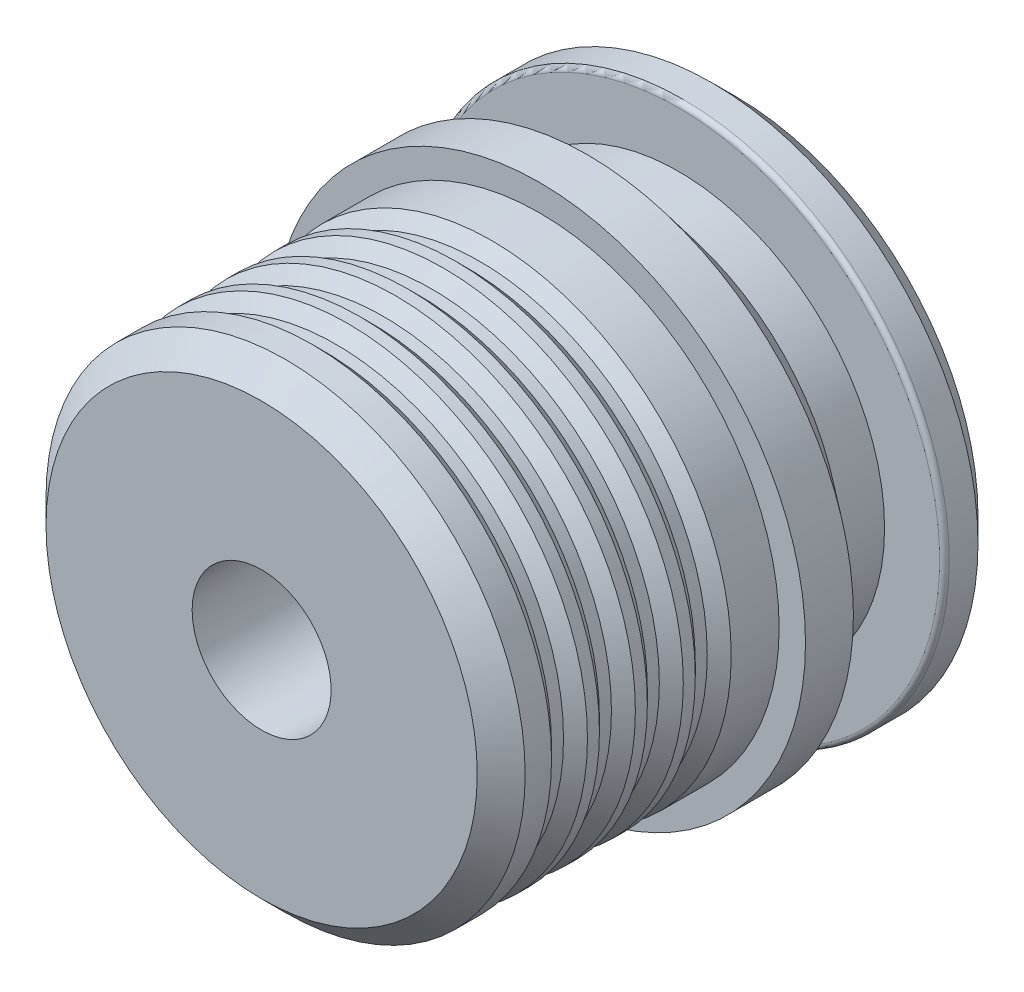
ISO-10303-21;
HEADER;
FILE_DESCRIPTION(('STEP AP214'),'2;1');
FILE_NAME('part.step','',(''),(''),'','','');
FILE_SCHEMA(('AUTOMOTIVE_DESIGN { 1 0 10303 214 1 1 1 1 }'));
ENDSEC;
DATA;
#1=APPLICATION_CONTEXT('core data for automotive mechanical design processes');
#2=APPLICATION_PROTOCOL_DEFINITION('international standard','automotive_design',2000,#1);
#3=PRODUCT_CONTEXT('',#1,'mechanical');
#4=PRODUCT('Part','Part','',(#3));
#5=PRODUCT_RELATED_PRODUCT_CATEGORY('part','',(#4));
#6=PRODUCT_DEFINITION_FORMATION('','',#4);
#7=PRODUCT_DEFINITION_CONTEXT('part definition',#1,'design');
#8=PRODUCT_DEFINITION('design','',#6,#7);
#9=PRODUCT_DEFINITION_SHAPE('','',#8);
#10=(LENGTH_UNIT() NAMED_UNIT(*) SI_UNIT(.MILLI.,.METRE.));
#11=(NAMED_UNIT(*) PLANE_ANGLE_UNIT() SI_UNIT($,.RADIAN.));
#12=(NAMED_UNIT(*) SI_UNIT($,.STERADIAN.) SOLID_ANGLE_UNIT());
#13=UNCERTAINTY_MEASURE_WITH_UNIT(LENGTH_MEASURE(1.E-05),#10,'distance_accuracy_value','');
#14=(GEOMETRIC_REPRESENTATION_CONTEXT(3) GLOBAL_UNCERTAINTY_ASSIGNED_CONTEXT((#13)) GLOBAL_UNIT_ASSIGNED_CONTEXT((#10,
#11,#12)) REPRESENTATION_CONTEXT('',''));
#15=CARTESIAN_POINT('',(0.,0.,0.));
#16=DIRECTION('',(0.,0.,1.));
#17=DIRECTION('',(1.,0.,0.));
#18=AXIS2_PLACEMENT_3D('',#15,#16,#17);
#19=CARTESIAN_POINT('',(0.,0.,10.7));
#20=DIRECTION('',(0.,0.,-1.));
#21=DIRECTION('',(-1.,0.,0.));
#22=AXIS2_PLACEMENT_3D('',#19,#20,#21);
#23=CONICAL_SURFACE('',#22,9.49999999999998,0.785398163397448);
#24=CARTESIAN_POINT('',(0.,0.,10.2));
#25=DIRECTION('',(0.,0.,-1.));
#26=DIRECTION('',(-1.,0.,0.));
#27=AXIS2_PLACEMENT_3D('',#24,#25,#26);
#28=CIRCLE('',#27,9.99999999999998);
#29=CARTESIAN_POINT('',(-9.99999999999998,0.,10.2));
#30=VERTEX_POINT('',#29);
#31=EDGE_CURVE('E62',#30,#30,#28,.T.);
#32=ORIENTED_EDGE('',*,*,#31,.F.);
#33=EDGE_LOOP('',(#32));
#34=FACE_BOUND('',#33,.T.);
#35=CARTESIAN_POINT('',(0.,0.,10.7));
#36=DIRECTION('',(0.,0.,-1.));
#37=DIRECTION('',(-1.,0.,0.));
#38=AXIS2_PLACEMENT_3D('',#35,#36,#37);
#39=CIRCLE('',#38,9.49999999999998);
#40=CARTESIAN_POINT('',(-9.49999999999998,0.,10.7));
#41=VERTEX_POINT('',#40);
#42=EDGE_CURVE('E143',#41,#41,#39,.T.);
#43=ORIENTED_EDGE('',*,*,#42,.T.);
#44=EDGE_LOOP('',(#43));
#45=FACE_BOUND('',#44,.T.);
#46=ADVANCED_FACE('F30',(#34,#45),#23,.T.);
#47=CARTESIAN_POINT('',(0.,0.,0.));
#48=DIRECTION('',(0.,0.,-1.));
#49=DIRECTION('',(-1.,0.,0.));
#50=AXIS2_PLACEMENT_3D('',#47,#48,#49);
#51=CYLINDRICAL_SURFACE('',#50,9.99999999999999);
#52=CARTESIAN_POINT('',(0.,0.,8.2));
#53=DIRECTION('',(0.,0.,-1.));
#54=DIRECTION('',(-1.,0.,0.));
#55=AXIS2_PLACEMENT_3D('',#52,#53,#54);
#56=CIRCLE('',#55,10.);
#57=CARTESIAN_POINT('',(-10.,0.,8.2));
#58=VERTEX_POINT('',#57);
#59=EDGE_CURVE('E65',#58,#58,#56,.T.);
#60=ORIENTED_EDGE('',*,*,#59,.F.);
#61=EDGE_LOOP('',(#60));
#62=FACE_BOUND('',#61,.T.);
#63=ORIENTED_EDGE('',*,*,#31,.T.);
#64=EDGE_LOOP('',(#63));
#65=FACE_BOUND('',#64,.T.);
#66=ADVANCED_FACE('F245',(#62,#65),#51,.T.);
#67=CARTESIAN_POINT('',(11.1,0.,8.2));
#68=DIRECTION('',(0.,0.,-1.));
#69=DIRECTION('',(-1.,0.,0.));
#70=AXIS2_PLACEMENT_3D('',#67,#68,#69);
#71=PLANE('',#70);
#72=CARTESIAN_POINT('',(0.,0.,8.2));
#73=DIRECTION('',(0.,0.,-1.));
#74=DIRECTION('',(-1.,0.,0.));
#75=AXIS2_PLACEMENT_3D('',#72,#73,#74);
#76=CIRCLE('',#75,11.1);
#77=CARTESIAN_POINT('',(-11.1,0.,8.2));
#78=VERTEX_POINT('',#77);
#79=EDGE_CURVE('E68',#78,#78,#76,.T.);
#80=ORIENTED_EDGE('',*,*,#79,.F.);
#81=EDGE_LOOP('',(#80));
#82=FACE_BOUND('',#81,.T.);
#83=ORIENTED_EDGE('',*,*,#59,.T.);
#84=EDGE_LOOP('',(#83));
#85=FACE_BOUND('',#84,.T.);
#86=ADVANCED_FACE('F251',(#82,#85),#71,.F.);
#87=CARTESIAN_POINT('',(0.,0.,0.));
#88=DIRECTION('',(0.,0.,-1.));
#89=DIRECTION('',(-1.,0.,0.));
#90=AXIS2_PLACEMENT_3D('',#87,#88,#89);
#91=CYLINDRICAL_SURFACE('',#90,11.1);
#92=CARTESIAN_POINT('',(0.,0.,6.2));
#93=DIRECTION('',(0.,0.,-1.));
#94=DIRECTION('',(-1.,0.,0.));
#95=AXIS2_PLACEMENT_3D('',#92,#93,#94);
#96=CIRCLE('',#95,11.1);
#97=CARTESIAN_POINT('',(-11.1,0.,6.2));
#98=VERTEX_POINT('',#97);
#99=EDGE_CURVE('E71',#98,#98,#96,.T.);
#100=ORIENTED_EDGE('',*,*,#99,.F.);
#101=EDGE_LOOP('',(#100));
#102=FACE_BOUND('',#101,.T.);
#103=ORIENTED_EDGE('',*,*,#79,.T.);
#104=EDGE_LOOP('',(#103));
#105=FACE_BOUND('',#104,.T.);
#106=ADVANCED_FACE('F315',(#102,#105),#91,.T.);
#107=CARTESIAN_POINT('',(0.,0.,6.2));
#108=DIRECTION('',(0.,0.,1.));
#109=DIRECTION('',(1.,0.,0.));
#110=AXIS2_PLACEMENT_3D('',#107,#108,#109);
#111=CONICAL_SURFACE('',#110,11.1,0.896055384571345);
#112=CARTESIAN_POINT('',(0.,0.,4.2));
#113=DIRECTION('',(0.,0.,-1.));
#114=DIRECTION('',(-1.,0.,0.));
#115=AXIS2_PLACEMENT_3D('',#112,#113,#114);
#116=CIRCLE('',#115,8.6);
#117=CARTESIAN_POINT('',(-8.6,0.,4.2));
#118=VERTEX_POINT('',#117);
#119=EDGE_CURVE('E74',#118,#118,#116,.T.);
#120=ORIENTED_EDGE('',*,*,#119,.F.);
#121=EDGE_LOOP('',(#120));
#122=FACE_BOUND('',#121,.T.);
#123=ORIENTED_EDGE('',*,*,#99,.T.);
#124=EDGE_LOOP('',(#123));
#125=FACE_BOUND('',#124,.T.);
#126=ADVANCED_FACE('F311',(#122,#125),#111,.T.);
#127=CARTESIAN_POINT('',(0.,0.,0.));
#128=DIRECTION('',(0.,0.,-1.));
#129=DIRECTION('',(-1.,0.,0.));
#130=AXIS2_PLACEMENT_3D('',#127,#128,#129);
#131=CYLINDRICAL_SURFACE('',#130,8.6);
#132=CARTESIAN_POINT('',(0.,0.,2.4));
#133=DIRECTION('',(0.,0.,-1.));
#134=DIRECTION('',(-1.,0.,0.));
#135=AXIS2_PLACEMENT_3D('',#132,#133,#134);
#136=CIRCLE('',#135,8.6);
#137=CARTESIAN_POINT('',(-8.6,0.,2.4));
#138=VERTEX_POINT('',#137);
#139=EDGE_CURVE('E77',#138,#138,#136,.T.);
#140=ORIENTED_EDGE('',*,*,#139,.F.);
#141=EDGE_LOOP('',(#140));
#142=FACE_BOUND('',#141,.T.);
#143=ORIENTED_EDGE('',*,*,#119,.T.);
#144=EDGE_LOOP('',(#143));
#145=FACE_BOUND('',#144,.T.);
#146=ADVANCED_FACE('F308',(#142,#145),#131,.T.);
#147=CARTESIAN_POINT('',(11.1,0.,2.4));
#148=DIRECTION('',(0.,0.,-1.));
#149=DIRECTION('',(-1.,0.,0.));
#150=AXIS2_PLACEMENT_3D('',#147,#148,#149);
#151=PLANE('',#150);
#152=CARTESIAN_POINT('',(0.,0.,2.4));
#153=DIRECTION('',(0.,0.,-1.));
#154=DIRECTION('',(-1.,0.,0.));
#155=AXIS2_PLACEMENT_3D('',#152,#153,#154);
#156=CIRCLE('',#155,10.9);
#157=CARTESIAN_POINT('',(-10.9,0.,2.4));
#158=VERTEX_POINT('',#157);
#159=EDGE_CURVE('E10',#158,#158,#156,.F.);
#160=ORIENTED_EDGE('',*,*,#159,.T.);
#161=EDGE_LOOP('',(#160));
#162=FACE_BOUND('',#161,.T.);
#163=ORIENTED_EDGE('',*,*,#139,.T.);
#164=EDGE_LOOP('',(#163));
#165=FACE_BOUND('',#164,.T.);
#166=ADVANCED_FACE('F305',(#162,#165),#151,.F.);
#167=CARTESIAN_POINT('',(0.,0.,0.));
#168=DIRECTION('',(0.,0.,-1.));
#169=DIRECTION('',(-1.,0.,0.));
#170=AXIS2_PLACEMENT_3D('',#167,#168,#169);
#171=CYLINDRICAL_SURFACE('',#170,11.1);
#172=CARTESIAN_POINT('',(0.,0.,2.2));
#173=DIRECTION('',(0.,0.,-1.));
#174=DIRECTION('',(-1.,0.,0.));
#175=AXIS2_PLACEMENT_3D('',#172,#173,#174);
#176=CIRCLE('',#175,11.1);
#177=CARTESIAN_POINT('',(-11.1,0.,2.2));
#178=VERTEX_POINT('',#177);
#179=EDGE_CURVE('E37',#178,#178,#176,.T.);
#180=ORIENTED_EDGE('',*,*,#179,.T.);
#181=EDGE_LOOP('',(#180));
#182=FACE_BOUND('',#181,.T.);
#183=CARTESIAN_POINT('',(0.,0.,1.));
#184=DIRECTION('',(0.,0.,1.));
#185=DIRECTION('',(1.,0.,0.));
#186=AXIS2_PLACEMENT_3D('',#183,#184,#185);
#187=CIRCLE('',#186,11.1);
#188=CARTESIAN_POINT('',(11.1,0.,1.));
#189=VERTEX_POINT('',#188);
#190=EDGE_CURVE('E41',#189,#189,#187,.T.);
#191=ORIENTED_EDGE('',*,*,#190,.T.);
#192=EDGE_LOOP('',(#191));
#193=FACE_BOUND('',#192,.T.);
#194=ADVANCED_FACE('F278',(#182,#193),#171,.T.);
#195=CARTESIAN_POINT('',(11.1,0.,0.));
#196=DIRECTION('',(0.,0.,1.));
#197=DIRECTION('',(1.,0.,0.));
#198=AXIS2_PLACEMENT_3D('',#195,#196,#197);
#199=PLANE('',#198);
#200=CARTESIAN_POINT('',(0.,0.,0.));
#201=DIRECTION('',(0.,0.,1.));
#202=DIRECTION('',(1.,0.,0.));
#203=AXIS2_PLACEMENT_3D('',#200,#201,#202);
#204=CIRCLE('',#203,10.1);
#205=CARTESIAN_POINT('',(10.1,0.,0.));
#206=VERTEX_POINT('',#205);
#207=EDGE_CURVE('E45',#206,#206,#204,.F.);
#208=ORIENTED_EDGE('',*,*,#207,.T.);
#209=EDGE_LOOP('',(#208));
#210=FACE_BOUND('',#209,.T.);
#211=CARTESIAN_POINT('',(0.,0.,0.));
#212=DIRECTION('',(0.,0.,1.));
#213=DIRECTION('',(1.,0.,0.));
#214=AXIS2_PLACEMENT_3D('',#211,#212,#213);
#215=CIRCLE('',#214,7.25000000000001);
#216=CARTESIAN_POINT('',(7.25000000000001,0.,0.));
#217=VERTEX_POINT('',#216);
#218=EDGE_CURVE('E50',#217,#217,#215,.T.);
#219=ORIENTED_EDGE('',*,*,#218,.T.);
#220=EDGE_LOOP('',(#219));
#221=FACE_BOUND('',#220,.T.);
#222=ADVANCED_FACE('F274',(#210,#221),#199,.F.);
#223=CARTESIAN_POINT('',(0.,0.,0.));
#224=DIRECTION('',(0.,0.,-1.));
#225=DIRECTION('',(-1.,0.,0.));
#226=AXIS2_PLACEMENT_3D('',#223,#224,#225);
#227=CYLINDRICAL_SURFACE('',#226,6.25);
#228=CARTESIAN_POINT('',(0.,0.,0.999999999999999));
#229=DIRECTION('',(0.,0.,1.));
#230=DIRECTION('',(1.,0.,0.));
#231=AXIS2_PLACEMENT_3D('',#228,#229,#230);
#232=CIRCLE('',#231,6.25);
#233=CARTESIAN_POINT('',(6.25,0.,0.999999999999999));
#234=VERTEX_POINT('',#233);
#235=EDGE_CURVE('E53',#234,#234,#232,.F.);
#236=ORIENTED_EDGE('',*,*,#235,.T.);
#237=EDGE_LOOP('',(#236));
#238=FACE_BOUND('',#237,.T.);
#239=CARTESIAN_POINT('',(0.,0.,7.73634480157131));
#240=DIRECTION('',(0.,0.,-1.));
#241=DIRECTION('',(-1.,0.,0.));
#242=AXIS2_PLACEMENT_3D('',#239,#240,#241);
#243=CIRCLE('',#242,6.25);
#244=CARTESIAN_POINT('',(-6.25,0.,7.73634480157131));
#245=VERTEX_POINT('',#244);
#246=EDGE_CURVE('E80',#245,#245,#243,.T.);
#247=ORIENTED_EDGE('',*,*,#246,.F.);
#248=EDGE_LOOP('',(#247));
#249=FACE_BOUND('',#248,.T.);
#250=ADVANCED_FACE('F277',(#238,#249),#227,.F.);
#251=CARTESIAN_POINT('',(0.,0.,7.73634480157131));
#252=DIRECTION('',(0.,0.,-1.));
#253=DIRECTION('',(-1.,0.,0.));
#254=AXIS2_PLACEMENT_3D('',#251,#252,#253);
#255=CONICAL_SURFACE('',#254,6.25,1.30899693899575);
#256=CARTESIAN_POINT('',(0.,0.,8.5));
#257=DIRECTION('',(0.,0.,-1.));
#258=DIRECTION('',(-1.,0.,0.));
#259=AXIS2_PLACEMENT_3D('',#256,#257,#258);
#260=CIRCLE('',#259,3.4);
#261=CARTESIAN_POINT('',(-3.4,0.,8.5));
#262=VERTEX_POINT('',#261);
#263=EDGE_CURVE('E83',#262,#262,#260,.T.);
#264=ORIENTED_EDGE('',*,*,#263,.F.);
#265=EDGE_LOOP('',(#264));
#266=FACE_BOUND('',#265,.T.);
#267=ORIENTED_EDGE('',*,*,#246,.T.);
#268=EDGE_LOOP('',(#267));
#269=FACE_BOUND('',#268,.T.);
#270=ADVANCED_FACE('F286',(#266,#269),#255,.F.);
#271=CARTESIAN_POINT('',(0.,0.,0.));
#272=DIRECTION('',(0.,0.,-1.));
#273=DIRECTION('',(-1.,0.,0.));
#274=AXIS2_PLACEMENT_3D('',#271,#272,#273);
#275=CYLINDRICAL_SURFACE('',#274,3.4);
#276=CARTESIAN_POINT('',(0.,0.,10.));
#277=DIRECTION('',(0.,0.,-1.));
#278=DIRECTION('',(-1.,0.,0.));
#279=AXIS2_PLACEMENT_3D('',#276,#277,#278);
#280=CIRCLE('',#279,3.4);
#281=CARTESIAN_POINT('',(-3.4,0.,10.));
#282=VERTEX_POINT('',#281);
#283=EDGE_CURVE('E86',#282,#282,#280,.T.);
#284=ORIENTED_EDGE('',*,*,#283,.F.);
#285=EDGE_LOOP('',(#284));
#286=FACE_BOUND('',#285,.T.);
#287=ORIENTED_EDGE('',*,*,#263,.T.);
#288=EDGE_LOOP('',(#287));
#289=FACE_BOUND('',#288,.T.);
#290=ADVANCED_FACE('F291',(#286,#289),#275,.F.);
#291=CARTESIAN_POINT('',(4.4,0.,10.));
#292=DIRECTION('',(0.,0.,-1.));
#293=DIRECTION('',(-1.,0.,0.));
#294=AXIS2_PLACEMENT_3D('',#291,#292,#293);
#295=PLANE('',#294);
#296=CARTESIAN_POINT('',(0.,0.,10.));
#297=DIRECTION('',(0.,0.,-1.));
#298=DIRECTION('',(-1.,0.,0.));
#299=AXIS2_PLACEMENT_3D('',#296,#297,#298);
#300=CIRCLE('',#299,4.4);
#301=CARTESIAN_POINT('',(-4.4,0.,10.));
#302=VERTEX_POINT('',#301);
#303=EDGE_CURVE('E89',#302,#302,#300,.T.);
#304=ORIENTED_EDGE('',*,*,#303,.F.);
#305=EDGE_LOOP('',(#304));
#306=FACE_BOUND('',#305,.T.);
#307=ORIENTED_EDGE('',*,*,#283,.T.);
#308=EDGE_LOOP('',(#307));
#309=FACE_BOUND('',#308,.T.);
#310=ADVANCED_FACE('F297',(#306,#309),#295,.F.);
#311=CARTESIAN_POINT('',(0.,0.,0.));
#312=DIRECTION('',(0.,0.,-1.));
#313=DIRECTION('',(-1.,0.,0.));
#314=AXIS2_PLACEMENT_3D('',#311,#312,#313);
#315=CYLINDRICAL_SURFACE('',#314,4.4);
#316=CARTESIAN_POINT('',(0.,0.,11.8));
#317=DIRECTION('',(0.,0.,-1.));
#318=DIRECTION('',(-1.,0.,0.));
#319=AXIS2_PLACEMENT_3D('',#316,#317,#318);
#320=CIRCLE('',#319,4.4);
#321=CARTESIAN_POINT('',(-4.4,0.,11.8));
#322=VERTEX_POINT('',#321);
#323=EDGE_CURVE('E92',#322,#322,#320,.T.);
#324=ORIENTED_EDGE('',*,*,#323,.F.);
#325=EDGE_LOOP('',(#324));
#326=FACE_BOUND('',#325,.T.);
#327=ORIENTED_EDGE('',*,*,#303,.T.);
#328=EDGE_LOOP('',(#327));
#329=FACE_BOUND('',#328,.T.);
#330=ADVANCED_FACE('F468',(#326,#329),#315,.F.);
#331=CARTESIAN_POINT('',(2.9,0.,11.8));
#332=DIRECTION('',(0.,0.,1.));
#333=DIRECTION('',(1.,0.,0.));
#334=AXIS2_PLACEMENT_3D('',#331,#332,#333);
#335=PLANE('',#334);
#336=CARTESIAN_POINT('',(0.,0.,11.8));
#337=DIRECTION('',(0.,0.,-1.));
#338=DIRECTION('',(-1.,0.,0.));
#339=AXIS2_PLACEMENT_3D('',#336,#337,#338);
#340=CIRCLE('',#339,2.9);
#341=CARTESIAN_POINT('',(-2.9,0.,11.8));
#342=VERTEX_POINT('',#341);
#343=EDGE_CURVE('E95',#342,#342,#340,.T.);
#344=ORIENTED_EDGE('',*,*,#343,.F.);
#345=EDGE_LOOP('',(#344));
#346=FACE_BOUND('',#345,.T.);
#347=ORIENTED_EDGE('',*,*,#323,.T.);
#348=EDGE_LOOP('',(#347));
#349=FACE_BOUND('',#348,.T.);
#350=ADVANCED_FACE('F458',(#346,#349),#335,.F.);
#351=CARTESIAN_POINT('',(0.,0.,0.));
#352=DIRECTION('',(0.,0.,-1.));
#353=DIRECTION('',(-1.,0.,0.));
#354=AXIS2_PLACEMENT_3D('',#351,#352,#353);
#355=CYLINDRICAL_SURFACE('',#354,2.9);
#356=CARTESIAN_POINT('',(0.,0.,19.8));
#357=DIRECTION('',(0.,0.,-1.));
#358=DIRECTION('',(-1.,0.,0.));
#359=AXIS2_PLACEMENT_3D('',#356,#357,#358);
#360=CIRCLE('',#359,2.9);
#361=CARTESIAN_POINT('',(-2.9,0.,19.8));
#362=VERTEX_POINT('',#361);
#363=EDGE_CURVE('E98',#362,#362,#360,.T.);
#364=ORIENTED_EDGE('',*,*,#363,.F.);
#365=EDGE_LOOP('',(#364));
#366=FACE_BOUND('',#365,.T.);
#367=ORIENTED_EDGE('',*,*,#343,.T.);
#368=EDGE_LOOP('',(#367));
#369=FACE_BOUND('',#368,.T.);
#370=ADVANCED_FACE('F241',(#366,#369),#355,.F.);
#371=CARTESIAN_POINT('',(10.,0.,19.8));
#372=DIRECTION('',(0.,0.,-1.));
#373=DIRECTION('',(-1.,0.,0.));
#374=AXIS2_PLACEMENT_3D('',#371,#372,#373);
#375=PLANE('',#374);
#376=CARTESIAN_POINT('',(0.,0.,19.8));
#377=DIRECTION('',(0.,0.,-1.));
#378=DIRECTION('',(-1.,0.,0.));
#379=AXIS2_PLACEMENT_3D('',#376,#377,#378);
#380=CIRCLE('',#379,8.99999999999999);
#381=CARTESIAN_POINT('',(-8.99999999999999,0.,19.8));
#382=VERTEX_POINT('',#381);
#383=EDGE_CURVE('E56',#382,#382,#380,.F.);
#384=ORIENTED_EDGE('',*,*,#383,.T.);
#385=EDGE_LOOP('',(#384));
#386=FACE_BOUND('',#385,.T.);
#387=ORIENTED_EDGE('',*,*,#363,.T.);
#388=EDGE_LOOP('',(#387));
#389=FACE_BOUND('',#388,.T.);
#390=ADVANCED_FACE('F235',(#386,#389),#375,.F.);
#391=CARTESIAN_POINT('',(0.,0.,0.));
#392=DIRECTION('',(0.,0.,-1.));
#393=DIRECTION('',(-1.,0.,0.));
#394=AXIS2_PLACEMENT_3D('',#391,#392,#393);
#395=CYLINDRICAL_SURFACE('',#394,10.);
#396=CARTESIAN_POINT('',(0.,0.,18.8));
#397=DIRECTION('',(0.,0.,-1.));
#398=DIRECTION('',(-1.,0.,0.));
#399=AXIS2_PLACEMENT_3D('',#396,#397,#398);
#400=CIRCLE('',#399,10.);
#401=CARTESIAN_POINT('',(-10.,0.,18.8));
#402=VERTEX_POINT('',#401);
#403=EDGE_CURVE('E59',#402,#402,#400,.T.);
#404=ORIENTED_EDGE('',*,*,#403,.T.);
#405=EDGE_LOOP('',(#404));
#406=FACE_BOUND('',#405,.T.);
#407=CARTESIAN_POINT('',(0.,0.,17.6999999999999));
#408=DIRECTION('',(0.,0.,-1.));
#409=DIRECTION('',(-1.,0.,0.));
#410=AXIS2_PLACEMENT_3D('',#407,#408,#409);
#411=CIRCLE('',#410,10.);
#412=CARTESIAN_POINT('',(-10.,0.,17.6999999999999));
#413=VERTEX_POINT('',#412);
#414=EDGE_CURVE('E101',#413,#413,#411,.T.);
#415=ORIENTED_EDGE('',*,*,#414,.F.);
#416=EDGE_LOOP('',(#415));
#417=FACE_BOUND('',#416,.T.);
#418=ADVANCED_FACE('F230',(#406,#417),#395,.T.);
#419=CARTESIAN_POINT('',(0.,0.,17.6999999999999));
#420=DIRECTION('',(0.,0.,1.));
#421=DIRECTION('',(1.,0.,0.));
#422=AXIS2_PLACEMENT_3D('',#419,#420,#421);
#423=CONICAL_SURFACE('',#422,10.,0.785398163397466);
#424=CARTESIAN_POINT('',(0.,0.,17.1999999999999));
#425=DIRECTION('',(0.,0.,-1.));
#426=DIRECTION('',(-1.,0.,0.));
#427=AXIS2_PLACEMENT_3D('',#424,#425,#426);
#428=CIRCLE('',#427,9.49999999999998);
#429=CARTESIAN_POINT('',(-9.49999999999998,0.,17.1999999999999));
#430=VERTEX_POINT('',#429);
#431=EDGE_CURVE('E104',#430,#430,#428,.T.);
#432=ORIENTED_EDGE('',*,*,#431,.F.);
#433=EDGE_LOOP('',(#432));
#434=FACE_BOUND('',#433,.T.);
#435=ORIENTED_EDGE('',*,*,#414,.T.);
#436=EDGE_LOOP('',(#435));
#437=FACE_BOUND('',#436,.T.);
#438=ADVANCED_FACE('F224',(#434,#437),#423,.T.);
#439=CARTESIAN_POINT('',(0.,0.,0.));
#440=DIRECTION('',(0.,0.,-1.));
#441=DIRECTION('',(-1.,0.,0.));
#442=AXIS2_PLACEMENT_3D('',#439,#440,#441);
#443=CYLINDRICAL_SURFACE('',#442,9.49999999999998);
#444=CARTESIAN_POINT('',(0.,0.,16.6999999999999));
#445=DIRECTION('',(0.,0.,-1.));
#446=DIRECTION('',(-1.,0.,0.));
#447=AXIS2_PLACEMENT_3D('',#444,#445,#446);
#448=CIRCLE('',#447,9.49999999999998);
#449=CARTESIAN_POINT('',(-9.49999999999998,0.,16.6999999999999));
#450=VERTEX_POINT('',#449);
#451=EDGE_CURVE('E107',#450,#450,#448,.T.);
#452=ORIENTED_EDGE('',*,*,#451,.F.);
#453=EDGE_LOOP('',(#452));
#454=FACE_BOUND('',#453,.T.);
#455=ORIENTED_EDGE('',*,*,#431,.T.);
#456=EDGE_LOOP('',(#455));
#457=FACE_BOUND('',#456,.T.);
#458=ADVANCED_FACE('F218',(#454,#457),#443,.T.);
#459=CARTESIAN_POINT('',(0.,0.,16.6999999999999));
#460=DIRECTION('',(0.,0.,-1.));
#461=DIRECTION('',(-1.,0.,0.));
#462=AXIS2_PLACEMENT_3D('',#459,#460,#461);
#463=CONICAL_SURFACE('',#462,9.49999999999998,0.78539816339745);
#464=CARTESIAN_POINT('',(0.,0.,16.1999999999999));
#465=DIRECTION('',(0.,0.,-1.));
#466=DIRECTION('',(-1.,0.,0.));
#467=AXIS2_PLACEMENT_3D('',#464,#465,#466);
#468=CIRCLE('',#467,9.99999999999998);
#469=CARTESIAN_POINT('',(-9.99999999999998,0.,16.1999999999999));
#470=VERTEX_POINT('',#469);
#471=EDGE_CURVE('E110',#470,#470,#468,.T.);
#472=ORIENTED_EDGE('',*,*,#471,.F.);
#473=EDGE_LOOP('',(#472));
#474=FACE_BOUND('',#473,.T.);
#475=ORIENTED_EDGE('',*,*,#451,.T.);
#476=EDGE_LOOP('',(#475));
#477=FACE_BOUND('',#476,.T.);
#478=ADVANCED_FACE('F212',(#474,#477),#463,.T.);
#479=CARTESIAN_POINT('',(0.,0.,0.));
#480=DIRECTION('',(0.,0.,-1.));
#481=DIRECTION('',(-1.,0.,0.));
#482=AXIS2_PLACEMENT_3D('',#479,#480,#481);
#483=CYLINDRICAL_SURFACE('',#482,9.99999999999999);
#484=CARTESIAN_POINT('',(0.,0.,15.6999999999999));
#485=DIRECTION('',(0.,0.,-1.));
#486=DIRECTION('',(-1.,0.,0.));
#487=AXIS2_PLACEMENT_3D('',#484,#485,#486);
#488=CIRCLE('',#487,10.);
#489=CARTESIAN_POINT('',(-10.,0.,15.6999999999999));
#490=VERTEX_POINT('',#489);
#491=EDGE_CURVE('E113',#490,#490,#488,.T.);
#492=ORIENTED_EDGE('',*,*,#491,.F.);
#493=EDGE_LOOP('',(#492));
#494=FACE_BOUND('',#493,.T.);
#495=ORIENTED_EDGE('',*,*,#471,.T.);
#496=EDGE_LOOP('',(#495));
#497=FACE_BOUND('',#496,.T.);
#498=ADVANCED_FACE('F206',(#494,#497),#483,.T.);
#499=CARTESIAN_POINT('',(0.,0.,15.6999999999999));
#500=DIRECTION('',(0.,0.,1.));
#501=DIRECTION('',(1.,0.,0.));
#502=AXIS2_PLACEMENT_3D('',#499,#500,#501);
#503=CONICAL_SURFACE('',#502,10.,0.785398163397467);
#504=CARTESIAN_POINT('',(0.,0.,15.2));
#505=DIRECTION('',(0.,0.,-1.));
#506=DIRECTION('',(-1.,0.,0.));
#507=AXIS2_PLACEMENT_3D('',#504,#505,#506);
#508=CIRCLE('',#507,9.49999999999998);
#509=CARTESIAN_POINT('',(-9.49999999999998,0.,15.2));
#510=VERTEX_POINT('',#509);
#511=EDGE_CURVE('E116',#510,#510,#508,.T.);
#512=ORIENTED_EDGE('',*,*,#511,.F.);
#513=EDGE_LOOP('',(#512));
#514=FACE_BOUND('',#513,.T.);
#515=ORIENTED_EDGE('',*,*,#491,.T.);
#516=EDGE_LOOP('',(#515));
#517=FACE_BOUND('',#516,.T.);
#518=ADVANCED_FACE('F200',(#514,#517),#503,.T.);
#519=CARTESIAN_POINT('',(0.,0.,0.));
#520=DIRECTION('',(0.,0.,-1.));
#521=DIRECTION('',(-1.,0.,0.));
#522=AXIS2_PLACEMENT_3D('',#519,#520,#521);
#523=CYLINDRICAL_SURFACE('',#522,9.49999999999998);
#524=CARTESIAN_POINT('',(0.,0.,14.7));
#525=DIRECTION('',(0.,0.,-1.));
#526=DIRECTION('',(-1.,0.,0.));
#527=AXIS2_PLACEMENT_3D('',#524,#525,#526);
#528=CIRCLE('',#527,9.49999999999998);
#529=CARTESIAN_POINT('',(-9.49999999999998,0.,14.7));
#530=VERTEX_POINT('',#529);
#531=EDGE_CURVE('E119',#530,#530,#528,.T.);
#532=ORIENTED_EDGE('',*,*,#531,.F.);
#533=EDGE_LOOP('',(#532));
#534=FACE_BOUND('',#533,.T.);
#535=ORIENTED_EDGE('',*,*,#511,.T.);
#536=EDGE_LOOP('',(#535));
#537=FACE_BOUND('',#536,.T.);
#538=ADVANCED_FACE('F194',(#534,#537),#523,.T.);
#539=CARTESIAN_POINT('',(0.,0.,14.7));
#540=DIRECTION('',(0.,0.,-1.));
#541=DIRECTION('',(-1.,0.,0.));
#542=AXIS2_PLACEMENT_3D('',#539,#540,#541);
#543=CONICAL_SURFACE('',#542,9.49999999999998,0.785398163397448);
#544=CARTESIAN_POINT('',(0.,0.,14.2));
#545=DIRECTION('',(0.,0.,-1.));
#546=DIRECTION('',(-1.,0.,0.));
#547=AXIS2_PLACEMENT_3D('',#544,#545,#546);
#548=CIRCLE('',#547,9.99999999999998);
#549=CARTESIAN_POINT('',(-9.99999999999998,0.,14.2));
#550=VERTEX_POINT('',#549);
#551=EDGE_CURVE('E122',#550,#550,#548,.T.);
#552=ORIENTED_EDGE('',*,*,#551,.F.);
#553=EDGE_LOOP('',(#552));
#554=FACE_BOUND('',#553,.T.);
#555=ORIENTED_EDGE('',*,*,#531,.T.);
#556=EDGE_LOOP('',(#555));
#557=FACE_BOUND('',#556,.T.);
#558=ADVANCED_FACE('F188',(#554,#557),#543,.T.);
#559=CARTESIAN_POINT('',(0.,0.,0.));
#560=DIRECTION('',(0.,0.,-1.));
#561=DIRECTION('',(-1.,0.,0.));
#562=AXIS2_PLACEMENT_3D('',#559,#560,#561);
#563=CYLINDRICAL_SURFACE('',#562,9.99999999999999);
#564=CARTESIAN_POINT('',(0.,0.,13.7));
#565=DIRECTION('',(0.,0.,-1.));
#566=DIRECTION('',(-1.,0.,0.));
#567=AXIS2_PLACEMENT_3D('',#564,#565,#566);
#568=CIRCLE('',#567,10.);
#569=CARTESIAN_POINT('',(-10.,0.,13.7));
#570=VERTEX_POINT('',#569);
#571=EDGE_CURVE('E125',#570,#570,#568,.T.);
#572=ORIENTED_EDGE('',*,*,#571,.F.);
#573=EDGE_LOOP('',(#572));
#574=FACE_BOUND('',#573,.T.);
#575=ORIENTED_EDGE('',*,*,#551,.T.);
#576=EDGE_LOOP('',(#575));
#577=FACE_BOUND('',#576,.T.);
#578=ADVANCED_FACE('F182',(#574,#577),#563,.T.);
#579=CARTESIAN_POINT('',(0.,0.,13.7));
#580=DIRECTION('',(0.,0.,1.));
#581=DIRECTION('',(1.,0.,0.));
#582=AXIS2_PLACEMENT_3D('',#579,#580,#581);
#583=CONICAL_SURFACE('',#582,10.,0.785398163397466);
#584=CARTESIAN_POINT('',(0.,0.,13.2));
#585=DIRECTION('',(0.,0.,-1.));
#586=DIRECTION('',(-1.,0.,0.));
#587=AXIS2_PLACEMENT_3D('',#584,#585,#586);
#588=CIRCLE('',#587,9.49999999999998);
#589=CARTESIAN_POINT('',(-9.49999999999998,0.,13.2));
#590=VERTEX_POINT('',#589);
#591=EDGE_CURVE('E128',#590,#590,#588,.T.);
#592=ORIENTED_EDGE('',*,*,#591,.F.);
#593=EDGE_LOOP('',(#592));
#594=FACE_BOUND('',#593,.T.);
#595=ORIENTED_EDGE('',*,*,#571,.T.);
#596=EDGE_LOOP('',(#595));
#597=FACE_BOUND('',#596,.T.);
#598=ADVANCED_FACE('F176',(#594,#597),#583,.T.);
#599=CARTESIAN_POINT('',(0.,0.,0.));
#600=DIRECTION('',(0.,0.,-1.));
#601=DIRECTION('',(-1.,0.,0.));
#602=AXIS2_PLACEMENT_3D('',#599,#600,#601);
#603=CYLINDRICAL_SURFACE('',#602,9.49999999999998);
#604=CARTESIAN_POINT('',(0.,0.,12.7));
#605=DIRECTION('',(0.,0.,-1.));
#606=DIRECTION('',(-1.,0.,0.));
#607=AXIS2_PLACEMENT_3D('',#604,#605,#606);
#608=CIRCLE('',#607,9.49999999999998);
#609=CARTESIAN_POINT('',(-9.49999999999998,0.,12.7));
#610=VERTEX_POINT('',#609);
#611=EDGE_CURVE('E131',#610,#610,#608,.T.);
#612=ORIENTED_EDGE('',*,*,#611,.F.);
#613=EDGE_LOOP('',(#612));
#614=FACE_BOUND('',#613,.T.);
#615=ORIENTED_EDGE('',*,*,#591,.T.);
#616=EDGE_LOOP('',(#615));
#617=FACE_BOUND('',#616,.T.);
#618=ADVANCED_FACE('F170',(#614,#617),#603,.T.);
#619=CARTESIAN_POINT('',(0.,0.,12.7));
#620=DIRECTION('',(0.,0.,-1.));
#621=DIRECTION('',(-1.,0.,0.));
#622=AXIS2_PLACEMENT_3D('',#619,#620,#621);
#623=CONICAL_SURFACE('',#622,9.49999999999998,0.785398163397448);
#624=CARTESIAN_POINT('',(0.,0.,12.2));
#625=DIRECTION('',(0.,0.,-1.));
#626=DIRECTION('',(-1.,0.,0.));
#627=AXIS2_PLACEMENT_3D('',#624,#625,#626);
#628=CIRCLE('',#627,9.99999999999998);
#629=CARTESIAN_POINT('',(-9.99999999999998,0.,12.2));
#630=VERTEX_POINT('',#629);
#631=EDGE_CURVE('E134',#630,#630,#628,.T.);
#632=ORIENTED_EDGE('',*,*,#631,.F.);
#633=EDGE_LOOP('',(#632));
#634=FACE_BOUND('',#633,.T.);
#635=ORIENTED_EDGE('',*,*,#611,.T.);
#636=EDGE_LOOP('',(#635));
#637=FACE_BOUND('',#636,.T.);
#638=ADVANCED_FACE('F164',(#634,#637),#623,.T.);
#639=CARTESIAN_POINT('',(0.,0.,0.));
#640=DIRECTION('',(0.,0.,-1.));
#641=DIRECTION('',(-1.,0.,0.));
#642=AXIS2_PLACEMENT_3D('',#639,#640,#641);
#643=CYLINDRICAL_SURFACE('',#642,9.99999999999999);
#644=CARTESIAN_POINT('',(0.,0.,11.7));
#645=DIRECTION('',(0.,0.,-1.));
#646=DIRECTION('',(-1.,0.,0.));
#647=AXIS2_PLACEMENT_3D('',#644,#645,#646);
#648=CIRCLE('',#647,10.);
#649=CARTESIAN_POINT('',(-10.,0.,11.7));
#650=VERTEX_POINT('',#649);
#651=EDGE_CURVE('E137',#650,#650,#648,.T.);
#652=ORIENTED_EDGE('',*,*,#651,.F.);
#653=EDGE_LOOP('',(#652));
#654=FACE_BOUND('',#653,.T.);
#655=ORIENTED_EDGE('',*,*,#631,.T.);
#656=EDGE_LOOP('',(#655));
#657=FACE_BOUND('',#656,.T.);
#658=ADVANCED_FACE('F158',(#654,#657),#643,.T.);
#659=CARTESIAN_POINT('',(0.,0.,11.7));
#660=DIRECTION('',(0.,0.,1.));
#661=DIRECTION('',(1.,0.,0.));
#662=AXIS2_PLACEMENT_3D('',#659,#660,#661);
#663=CONICAL_SURFACE('',#662,10.,0.785398163397466);
#664=CARTESIAN_POINT('',(0.,0.,11.2));
#665=DIRECTION('',(0.,0.,-1.));
#666=DIRECTION('',(-1.,0.,0.));
#667=AXIS2_PLACEMENT_3D('',#664,#665,#666);
#668=CIRCLE('',#667,9.49999999999998);
#669=CARTESIAN_POINT('',(-9.49999999999998,0.,11.2));
#670=VERTEX_POINT('',#669);
#671=EDGE_CURVE('E140',#670,#670,#668,.T.);
#672=ORIENTED_EDGE('',*,*,#671,.F.);
#673=EDGE_LOOP('',(#672));
#674=FACE_BOUND('',#673,.T.);
#675=ORIENTED_EDGE('',*,*,#651,.T.);
#676=EDGE_LOOP('',(#675));
#677=FACE_BOUND('',#676,.T.);
#678=ADVANCED_FACE('F152',(#674,#677),#663,.T.);
#679=CARTESIAN_POINT('',(0.,0.,0.));
#680=DIRECTION('',(0.,0.,-1.));
#681=DIRECTION('',(-1.,0.,0.));
#682=AXIS2_PLACEMENT_3D('',#679,#680,#681);
#683=CYLINDRICAL_SURFACE('',#682,9.49999999999998);
#684=ORIENTED_EDGE('',*,*,#42,.F.);
#685=EDGE_LOOP('',(#684));
#686=FACE_BOUND('',#685,.T.);
#687=ORIENTED_EDGE('',*,*,#671,.T.);
#688=EDGE_LOOP('',(#687));
#689=FACE_BOUND('',#688,.T.);
#690=ADVANCED_FACE('F148',(#686,#689),#683,.T.);
#691=CARTESIAN_POINT('',(0.,0.,18.8));
#692=DIRECTION('',(0.,0.,-1.));
#693=DIRECTION('',(-1.,0.,0.));
#694=AXIS2_PLACEMENT_3D('',#691,#692,#693);
#695=CONICAL_SURFACE('',#694,10.,0.785398163397451);
#696=ORIENTED_EDGE('',*,*,#383,.F.);
#697=EDGE_LOOP('',(#696));
#698=FACE_BOUND('',#697,.T.);
#699=ORIENTED_EDGE('',*,*,#403,.F.);
#700=EDGE_LOOP('',(#699));
#701=FACE_BOUND('',#700,.T.);
#702=ADVANCED_FACE('F151',(#698,#701),#695,.T.);
#703=CARTESIAN_POINT('',(0.,0.,0.999999999999999));
#704=DIRECTION('',(0.,0.,-1.));
#705=DIRECTION('',(-1.,0.,0.));
#706=AXIS2_PLACEMENT_3D('',#703,#704,#705);
#707=CONICAL_SURFACE('',#706,6.25,0.785398163397451);
#708=ORIENTED_EDGE('',*,*,#218,.F.);
#709=EDGE_LOOP('',(#708));
#710=FACE_BOUND('',#709,.T.);
#711=ORIENTED_EDGE('',*,*,#235,.F.);
#712=EDGE_LOOP('',(#711));
#713=FACE_BOUND('',#712,.T.);
#714=ADVANCED_FACE('F259',(#710,#713),#707,.F.);
#715=CARTESIAN_POINT('',(0.,0.,0.));
#716=DIRECTION('',(0.,0.,1.));
#717=DIRECTION('',(1.,0.,0.));
#718=AXIS2_PLACEMENT_3D('',#715,#716,#717);
#719=CONICAL_SURFACE('',#718,10.1,0.785398163397447);
#720=ORIENTED_EDGE('',*,*,#190,.F.);
#721=EDGE_LOOP('',(#720));
#722=FACE_BOUND('',#721,.T.);
#723=ORIENTED_EDGE('',*,*,#207,.F.);
#724=EDGE_LOOP('',(#723));
#725=FACE_BOUND('',#724,.T.);
#726=ADVANCED_FACE('F262',(#722,#725),#719,.T.);
#727=CARTESIAN_POINT('',(0.,0.,2.2));
#728=DIRECTION('',(0.,0.,-1.));
#729=DIRECTION('',(-1.,0.,0.));
#730=AXIS2_PLACEMENT_3D('',#727,#728,#729);
#731=TOROIDAL_SURFACE('',#730,10.9,0.2);
#732=ORIENTED_EDGE('',*,*,#159,.F.);
#733=EDGE_LOOP('',(#732));
#734=FACE_BOUND('',#733,.T.);
#735=ORIENTED_EDGE('',*,*,#179,.F.);
#736=EDGE_LOOP('',(#735));
#737=FACE_BOUND('',#736,.T.);
#738=ADVANCED_FACE('F32',(#734,#737),#731,.T.);
#739=CLOSED_SHELL('',(#46,#66,#86,#106,#126,#146,#166,#194,#222,#250,#270,#290,#310,#330,#350,
#370,#390,#418,#438,#458,#478,#498,#518,#538,#558,#578,#598,#618,#638,#658,#678,#690,#702,#714,
#726,#738));
#740=MANIFOLD_SOLID_BREP('B2',#739);
#741=ADVANCED_BREP_SHAPE_REPRESENTATION('',(#18,#740),#14);
#742=SHAPE_DEFINITION_REPRESENTATION(#9,#741);
ENDSEC;
END-ISO-10303-21;
